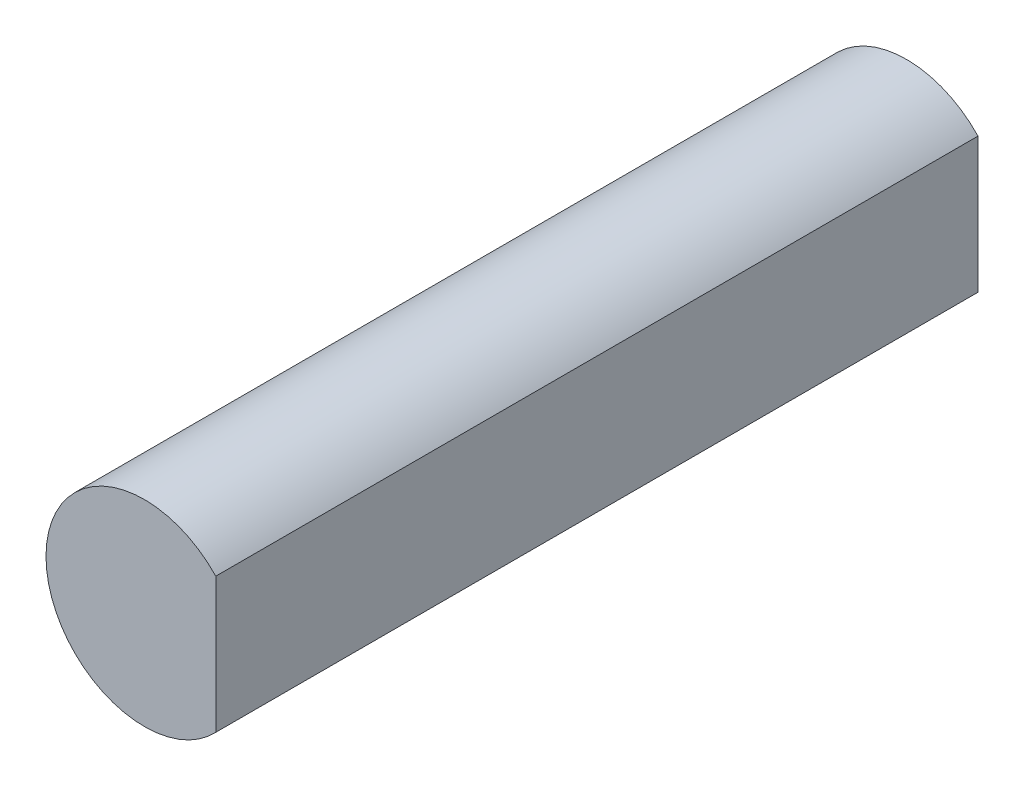
ISO-10303-21;
HEADER;
FILE_DESCRIPTION(('STEP AP214'),'2;1');
FILE_NAME('part.step','',(''),(''),'','','');
FILE_SCHEMA(('AUTOMOTIVE_DESIGN { 1 0 10303 214 1 1 1 1 }'));
ENDSEC;
DATA;
#1=APPLICATION_CONTEXT('core data for automotive mechanical design processes');
#2=APPLICATION_PROTOCOL_DEFINITION('international standard','automotive_design',2000,#1);
#3=PRODUCT_CONTEXT('',#1,'mechanical');
#4=PRODUCT('Part','Part','',(#3));
#5=PRODUCT_RELATED_PRODUCT_CATEGORY('part','',(#4));
#6=PRODUCT_DEFINITION_FORMATION('','',#4);
#7=PRODUCT_DEFINITION_CONTEXT('part definition',#1,'design');
#8=PRODUCT_DEFINITION('design','',#6,#7);
#9=PRODUCT_DEFINITION_SHAPE('','',#8);
#10=(LENGTH_UNIT() NAMED_UNIT(*) SI_UNIT(.MILLI.,.METRE.));
#11=(NAMED_UNIT(*) PLANE_ANGLE_UNIT() SI_UNIT($,.RADIAN.));
#12=(NAMED_UNIT(*) SI_UNIT($,.STERADIAN.) SOLID_ANGLE_UNIT());
#13=UNCERTAINTY_MEASURE_WITH_UNIT(LENGTH_MEASURE(1.E-05),#10,'distance_accuracy_value','');
#14=(GEOMETRIC_REPRESENTATION_CONTEXT(3) GLOBAL_UNCERTAINTY_ASSIGNED_CONTEXT((#13)) GLOBAL_UNIT_ASSIGNED_CONTEXT((#10,
#11,#12)) REPRESENTATION_CONTEXT('',''));
#15=CARTESIAN_POINT('',(0.,0.,0.));
#16=DIRECTION('',(0.,0.,1.));
#17=DIRECTION('',(1.,0.,0.));
#18=AXIS2_PLACEMENT_3D('',#15,#16,#17);
#19=CARTESIAN_POINT('',(2.,1.5,31.));
#20=DIRECTION('',(-1.,0.,0.));
#21=DIRECTION('',(0.,0.,1.));
#22=AXIS2_PLACEMENT_3D('',#19,#20,#21);
#23=PLANE('',#22);
#24=DIRECTION('',(0.,0.,-1.));
#25=VECTOR('',#24,1.);
#26=CARTESIAN_POINT('',(2.,1.5,31.));
#27=LINE('',#26,#25);
#28=CARTESIAN_POINT('',(2.,1.5,24.8));
#29=VERTEX_POINT('',#28);
#30=CARTESIAN_POINT('',(2.,1.5,5.));
#31=VERTEX_POINT('',#30);
#32=EDGE_CURVE('E93',#29,#31,#27,.T.);
#33=ORIENTED_EDGE('',*,*,#32,.T.);
#34=DIRECTION('',(0.,-1.,0.));
#35=VECTOR('',#34,1.);
#36=CARTESIAN_POINT('',(2.,1.5,5.));
#37=LINE('',#36,#35);
#38=CARTESIAN_POINT('',(2.,-1.5,5.));
#39=VERTEX_POINT('',#38);
#40=EDGE_CURVE('E11',#31,#39,#37,.T.);
#41=ORIENTED_EDGE('',*,*,#40,.T.);
#42=DIRECTION('',(0.,0.,-1.));
#43=VECTOR('',#42,1.);
#44=CARTESIAN_POINT('',(2.,-1.5,31.));
#45=LINE('',#44,#43);
#46=CARTESIAN_POINT('',(2.,-1.5,24.8));
#47=VERTEX_POINT('',#46);
#48=EDGE_CURVE('E90',#47,#39,#45,.T.);
#49=ORIENTED_EDGE('',*,*,#48,.F.);
#50=DIRECTION('',(0.,1.,0.));
#51=VECTOR('',#50,1.);
#52=CARTESIAN_POINT('',(2.,1.5,24.8));
#53=LINE('',#52,#51);
#54=EDGE_CURVE('E47',#47,#29,#53,.T.);
#55=ORIENTED_EDGE('',*,*,#54,.T.);
#56=EDGE_LOOP('',(#33,#41,#49,#55));
#57=FACE_BOUND('',#56,.T.);
#58=ADVANCED_FACE('F39',(#57),#23,.T.);
#59=CARTESIAN_POINT('',(0.,0.,31.));
#60=DIRECTION('',(0.,0.,-1.));
#61=DIRECTION('',(-1.,0.,0.));
#62=AXIS2_PLACEMENT_3D('',#59,#60,#61);
#63=CYLINDRICAL_SURFACE('',#62,2.5);
#64=CARTESIAN_POINT('',(0.,0.,0.));
#65=DIRECTION('',(0.,0.,1.));
#66=DIRECTION('',(1.,0.,0.));
#67=AXIS2_PLACEMENT_3D('',#64,#65,#66);
#68=CIRCLE('',#67,2.5);
#69=CARTESIAN_POINT('',(2.5,0.,0.));
#70=VERTEX_POINT('',#69);
#71=EDGE_CURVE('E108',#70,#70,#68,.T.);
#72=ORIENTED_EDGE('',*,*,#71,.F.);
#73=EDGE_LOOP('',(#72));
#74=FACE_BOUND('',#73,.T.);
#75=CARTESIAN_POINT('',(0.,0.,5.));
#76=DIRECTION('',(0.,0.,-1.));
#77=DIRECTION('',(-1.,0.,0.));
#78=AXIS2_PLACEMENT_3D('',#75,#76,#77);
#79=CIRCLE('',#78,2.5);
#80=EDGE_CURVE('E107',#31,#39,#79,.T.);
#81=ORIENTED_EDGE('',*,*,#80,.F.);
#82=ORIENTED_EDGE('',*,*,#32,.F.);
#83=CARTESIAN_POINT('',(0.,0.,24.8));
#84=DIRECTION('',(0.,0.,1.));
#85=DIRECTION('',(1.,0.,0.));
#86=AXIS2_PLACEMENT_3D('',#83,#84,#85);
#87=CIRCLE('',#86,2.5);
#88=EDGE_CURVE('E53',#29,#47,#87,.T.);
#89=ORIENTED_EDGE('',*,*,#88,.T.);
#90=ORIENTED_EDGE('',*,*,#48,.T.);
#91=EDGE_LOOP('',(#81,#82,#89,#90));
#92=FACE_BOUND('',#91,.T.);
#93=ADVANCED_FACE('F105',(#74,#92),#63,.F.);
#94=CARTESIAN_POINT('',(0.,0.,31.));
#95=DIRECTION('',(0.,0.,1.));
#96=DIRECTION('',(1.,0.,0.));
#97=AXIS2_PLACEMENT_3D('',#94,#95,#96);
#98=PLANE('',#97);
#99=CARTESIAN_POINT('',(0.,0.,31.));
#100=DIRECTION('',(0.,0.,1.));
#101=DIRECTION('',(1.,0.,0.));
#102=AXIS2_PLACEMENT_3D('',#99,#100,#101);
#103=CIRCLE('',#102,4.);
#104=CARTESIAN_POINT('',(2.90473750965556,2.75,31.));
#105=VERTEX_POINT('',#104);
#106=CARTESIAN_POINT('',(2.90473750965556,-2.75,31.));
#107=VERTEX_POINT('',#106);
#108=EDGE_CURVE('E79',#105,#107,#103,.T.);
#109=ORIENTED_EDGE('',*,*,#108,.T.);
#110=DIRECTION('',(0.,1.,0.));
#111=VECTOR('',#110,1.);
#112=CARTESIAN_POINT('',(2.90473750965556,2.75,31.));
#113=LINE('',#112,#111);
#114=EDGE_CURVE('E61',#107,#105,#113,.T.);
#115=ORIENTED_EDGE('',*,*,#114,.T.);
#116=EDGE_LOOP('',(#109,#115));
#117=FACE_BOUND('',#116,.T.);
#118=ADVANCED_FACE('F113',(#117),#98,.T.);
#119=CARTESIAN_POINT('',(0.,0.,0.));
#120=DIRECTION('',(0.,0.,1.));
#121=DIRECTION('',(1.,0.,0.));
#122=AXIS2_PLACEMENT_3D('',#119,#120,#121);
#123=PLANE('',#122);
#124=CARTESIAN_POINT('',(0.,0.,0.));
#125=DIRECTION('',(0.,0.,1.));
#126=DIRECTION('',(1.,0.,0.));
#127=AXIS2_PLACEMENT_3D('',#124,#125,#126);
#128=CIRCLE('',#127,4.);
#129=CARTESIAN_POINT('',(2.90473750965556,2.75,0.));
#130=VERTEX_POINT('',#129);
#131=CARTESIAN_POINT('',(2.90473750965556,-2.75,0.));
#132=VERTEX_POINT('',#131);
#133=EDGE_CURVE('E78',#130,#132,#128,.T.);
#134=ORIENTED_EDGE('',*,*,#133,.F.);
#135=DIRECTION('',(0.,1.,0.));
#136=VECTOR('',#135,1.);
#137=CARTESIAN_POINT('',(2.90473750965556,2.75,0.));
#138=LINE('',#137,#136);
#139=EDGE_CURVE('E84',#132,#130,#138,.T.);
#140=ORIENTED_EDGE('',*,*,#139,.F.);
#141=EDGE_LOOP('',(#134,#140));
#142=FACE_BOUND('',#141,.T.);
#143=ORIENTED_EDGE('',*,*,#71,.T.);
#144=EDGE_LOOP('',(#143));
#145=FACE_BOUND('',#144,.T.);
#146=ADVANCED_FACE('F88',(#142,#145),#123,.F.);
#147=CARTESIAN_POINT('',(0.,0.,31.));
#148=DIRECTION('',(0.,0.,-1.));
#149=DIRECTION('',(-1.,0.,0.));
#150=AXIS2_PLACEMENT_3D('',#147,#148,#149);
#151=CYLINDRICAL_SURFACE('',#150,4.);
#152=DIRECTION('',(0.,0.,-1.));
#153=VECTOR('',#152,1.);
#154=CARTESIAN_POINT('',(2.90473750965556,2.75,31.));
#155=LINE('',#154,#153);
#156=EDGE_CURVE('E74',#105,#130,#155,.T.);
#157=ORIENTED_EDGE('',*,*,#156,.T.);
#158=ORIENTED_EDGE('',*,*,#133,.T.);
#159=DIRECTION('',(0.,0.,-1.));
#160=VECTOR('',#159,1.);
#161=CARTESIAN_POINT('',(2.90473750965556,-2.75,31.));
#162=LINE('',#161,#160);
#163=EDGE_CURVE('E81',#107,#132,#162,.T.);
#164=ORIENTED_EDGE('',*,*,#163,.F.);
#165=ORIENTED_EDGE('',*,*,#108,.F.);
#166=EDGE_LOOP('',(#157,#158,#164,#165));
#167=FACE_BOUND('',#166,.T.);
#168=ADVANCED_FACE('F41',(#167),#151,.T.);
#169=CARTESIAN_POINT('',(2.90473750965556,2.75,31.));
#170=DIRECTION('',(-1.,0.,0.));
#171=DIRECTION('',(0.,0.,1.));
#172=AXIS2_PLACEMENT_3D('',#169,#170,#171);
#173=PLANE('',#172);
#174=ORIENTED_EDGE('',*,*,#163,.T.);
#175=ORIENTED_EDGE('',*,*,#139,.T.);
#176=ORIENTED_EDGE('',*,*,#156,.F.);
#177=ORIENTED_EDGE('',*,*,#114,.F.);
#178=EDGE_LOOP('',(#174,#175,#176,#177));
#179=FACE_BOUND('',#178,.T.);
#180=ADVANCED_FACE('F85',(#179),#173,.F.);
#181=CARTESIAN_POINT('',(0.,0.,24.8));
#182=DIRECTION('',(0.,0.,1.));
#183=DIRECTION('',(1.,0.,0.));
#184=AXIS2_PLACEMENT_3D('',#181,#182,#183);
#185=PLANE('',#184);
#186=ORIENTED_EDGE('',*,*,#88,.F.);
#187=ORIENTED_EDGE('',*,*,#54,.F.);
#188=EDGE_LOOP('',(#186,#187));
#189=FACE_BOUND('',#188,.T.);
#190=ADVANCED_FACE('F130',(#189),#185,.F.);
#191=CARTESIAN_POINT('',(0.,0.,5.));
#192=DIRECTION('',(0.,0.,-1.));
#193=DIRECTION('',(-1.,0.,0.));
#194=AXIS2_PLACEMENT_3D('',#191,#192,#193);
#195=PLANE('',#194);
#196=ORIENTED_EDGE('',*,*,#80,.T.);
#197=ORIENTED_EDGE('',*,*,#40,.F.);
#198=EDGE_LOOP('',(#196,#197));
#199=FACE_BOUND('',#198,.T.);
#200=ADVANCED_FACE('F132',(#199),#195,.T.);
#201=CLOSED_SHELL('',(#58,#93,#118,#146,#168,#180,#190,#200));
#202=MANIFOLD_SOLID_BREP('B2',#201);
#203=ADVANCED_BREP_SHAPE_REPRESENTATION('',(#18,#202),#14);
#204=SHAPE_DEFINITION_REPRESENTATION(#9,#203);
ENDSEC;
END-ISO-10303-21;
